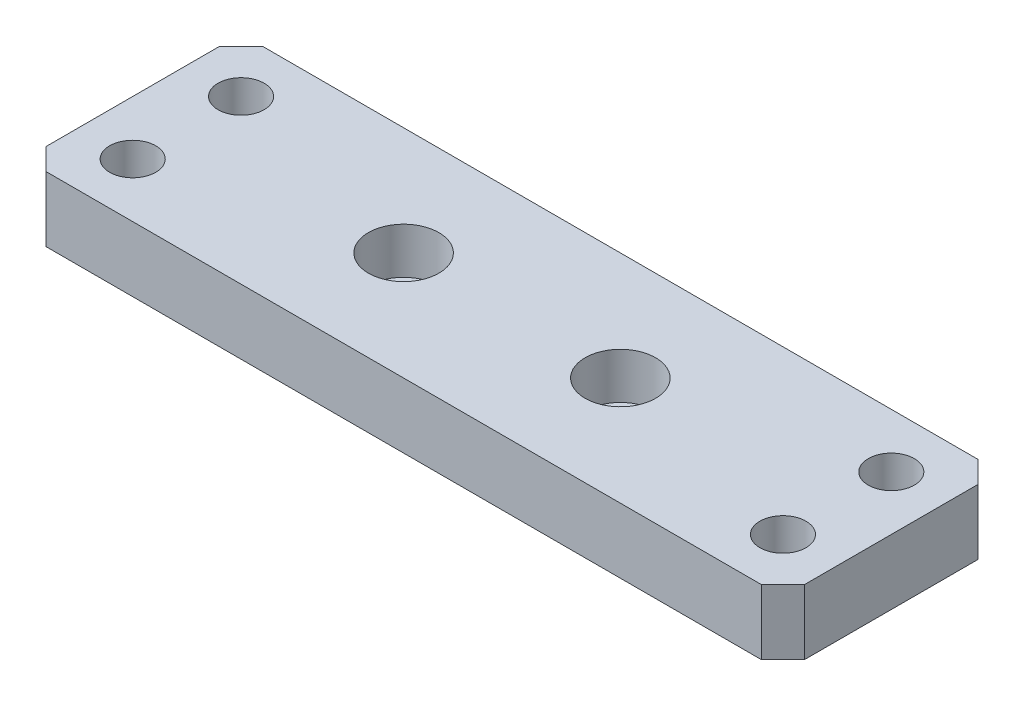
ISO-10303-21;
HEADER;
FILE_DESCRIPTION(('STEP AP214'),'2;1');
FILE_NAME('part.step','',(''),(''),'','','');
FILE_SCHEMA(('AUTOMOTIVE_DESIGN { 1 0 10303 214 1 1 1 1 }'));
ENDSEC;
DATA;
#1=APPLICATION_CONTEXT('core data for automotive mechanical design processes');
#2=APPLICATION_PROTOCOL_DEFINITION('international standard','automotive_design',2000,#1);
#3=PRODUCT_CONTEXT('',#1,'mechanical');
#4=PRODUCT('Part','Part','',(#3));
#5=PRODUCT_RELATED_PRODUCT_CATEGORY('part','',(#4));
#6=PRODUCT_DEFINITION_FORMATION('','',#4);
#7=PRODUCT_DEFINITION_CONTEXT('part definition',#1,'design');
#8=PRODUCT_DEFINITION('design','',#6,#7);
#9=PRODUCT_DEFINITION_SHAPE('','',#8);
#10=(LENGTH_UNIT() NAMED_UNIT(*) SI_UNIT(.MILLI.,.METRE.));
#11=(NAMED_UNIT(*) PLANE_ANGLE_UNIT() SI_UNIT($,.RADIAN.));
#12=(NAMED_UNIT(*) SI_UNIT($,.STERADIAN.) SOLID_ANGLE_UNIT());
#13=UNCERTAINTY_MEASURE_WITH_UNIT(LENGTH_MEASURE(1.E-05),#10,'distance_accuracy_value','');
#14=(GEOMETRIC_REPRESENTATION_CONTEXT(3) GLOBAL_UNCERTAINTY_ASSIGNED_CONTEXT((#13)) GLOBAL_UNIT_ASSIGNED_CONTEXT((#10,
#11,#12)) REPRESENTATION_CONTEXT('',''));
#15=CARTESIAN_POINT('',(0.,0.,0.));
#16=DIRECTION('',(0.,0.,1.));
#17=DIRECTION('',(1.,0.,0.));
#18=AXIS2_PLACEMENT_3D('',#15,#16,#17);
#19=CARTESIAN_POINT('',(-70.,-6.,20.));
#20=DIRECTION('',(0.,0.,1.));
#21=DIRECTION('',(1.,0.,0.));
#22=AXIS2_PLACEMENT_3D('',#19,#20,#21);
#23=PLANE('',#22);
#24=DIRECTION('',(1.,0.,0.));
#25=VECTOR('',#24,1.);
#26=CARTESIAN_POINT('',(-70.,6.,20.));
#27=LINE('',#26,#25);
#28=CARTESIAN_POINT('',(-66.,6.,20.));
#29=VERTEX_POINT('',#28);
#30=CARTESIAN_POINT('',(66.,6.,20.));
#31=VERTEX_POINT('',#30);
#32=EDGE_CURVE('E146',#29,#31,#27,.T.);
#33=ORIENTED_EDGE('',*,*,#32,.F.);
#34=DIRECTION('',(0.,-1.,0.));
#35=VECTOR('',#34,1.);
#36=CARTESIAN_POINT('',(-66.,-6.,20.));
#37=LINE('',#36,#35);
#38=CARTESIAN_POINT('',(-66.,-6.,20.));
#39=VERTEX_POINT('',#38);
#40=EDGE_CURVE('E11',#29,#39,#37,.T.);
#41=ORIENTED_EDGE('',*,*,#40,.T.);
#42=DIRECTION('',(1.,0.,0.));
#43=VECTOR('',#42,1.);
#44=CARTESIAN_POINT('',(-70.,-6.,20.));
#45=LINE('',#44,#43);
#46=CARTESIAN_POINT('',(66.,-6.,20.));
#47=VERTEX_POINT('',#46);
#48=EDGE_CURVE('E149',#39,#47,#45,.T.);
#49=ORIENTED_EDGE('',*,*,#48,.T.);
#50=DIRECTION('',(0.,1.,0.));
#51=VECTOR('',#50,1.);
#52=CARTESIAN_POINT('',(66.,-6.,20.));
#53=LINE('',#52,#51);
#54=EDGE_CURVE('E25',#47,#31,#53,.T.);
#55=ORIENTED_EDGE('',*,*,#54,.T.);
#56=EDGE_LOOP('',(#33,#41,#49,#55));
#57=FACE_BOUND('',#56,.T.);
#58=ADVANCED_FACE('F17',(#57),#23,.T.);
#59=CARTESIAN_POINT('',(-70.,-6.,-20.));
#60=DIRECTION('',(-1.,0.,0.));
#61=DIRECTION('',(0.,0.,1.));
#62=AXIS2_PLACEMENT_3D('',#59,#60,#61);
#63=PLANE('',#62);
#64=DIRECTION('',(0.,0.,1.));
#65=VECTOR('',#64,1.);
#66=CARTESIAN_POINT('',(-70.,6.,-20.));
#67=LINE('',#66,#65);
#68=CARTESIAN_POINT('',(-70.,6.,-16.));
#69=VERTEX_POINT('',#68);
#70=CARTESIAN_POINT('',(-70.,6.,16.));
#71=VERTEX_POINT('',#70);
#72=EDGE_CURVE('E103',#69,#71,#67,.T.);
#73=ORIENTED_EDGE('',*,*,#72,.F.);
#74=DIRECTION('',(0.,-1.,0.));
#75=VECTOR('',#74,1.);
#76=CARTESIAN_POINT('',(-70.,-6.,-16.));
#77=LINE('',#76,#75);
#78=CARTESIAN_POINT('',(-70.,-6.,-16.));
#79=VERTEX_POINT('',#78);
#80=EDGE_CURVE('E123',#69,#79,#77,.T.);
#81=ORIENTED_EDGE('',*,*,#80,.T.);
#82=DIRECTION('',(0.,0.,1.));
#83=VECTOR('',#82,1.);
#84=CARTESIAN_POINT('',(-70.,-6.,-20.));
#85=LINE('',#84,#83);
#86=CARTESIAN_POINT('',(-70.,-6.,16.));
#87=VERTEX_POINT('',#86);
#88=EDGE_CURVE('E106',#79,#87,#85,.T.);
#89=ORIENTED_EDGE('',*,*,#88,.T.);
#90=DIRECTION('',(0.,1.,0.));
#91=VECTOR('',#90,1.);
#92=CARTESIAN_POINT('',(-70.,-6.,16.));
#93=LINE('',#92,#91);
#94=EDGE_CURVE('E119',#87,#71,#93,.T.);
#95=ORIENTED_EDGE('',*,*,#94,.T.);
#96=EDGE_LOOP('',(#73,#81,#89,#95));
#97=FACE_BOUND('',#96,.T.);
#98=ADVANCED_FACE('F262',(#97),#63,.T.);
#99=CARTESIAN_POINT('',(70.,-6.,-20.));
#100=DIRECTION('',(0.,0.,-1.));
#101=DIRECTION('',(-1.,0.,0.));
#102=AXIS2_PLACEMENT_3D('',#99,#100,#101);
#103=PLANE('',#102);
#104=DIRECTION('',(-1.,0.,0.));
#105=VECTOR('',#104,1.);
#106=CARTESIAN_POINT('',(70.,-6.,-20.));
#107=LINE('',#106,#105);
#108=CARTESIAN_POINT('',(66.,-6.,-20.));
#109=VERTEX_POINT('',#108);
#110=CARTESIAN_POINT('',(-66.,-6.,-20.));
#111=VERTEX_POINT('',#110);
#112=EDGE_CURVE('E112',#109,#111,#107,.T.);
#113=ORIENTED_EDGE('',*,*,#112,.T.);
#114=DIRECTION('',(0.,1.,0.));
#115=VECTOR('',#114,1.);
#116=CARTESIAN_POINT('',(-66.,-6.,-20.));
#117=LINE('',#116,#115);
#118=CARTESIAN_POINT('',(-66.,6.,-20.));
#119=VERTEX_POINT('',#118);
#120=EDGE_CURVE('E101',#111,#119,#117,.T.);
#121=ORIENTED_EDGE('',*,*,#120,.T.);
#122=DIRECTION('',(-1.,0.,0.));
#123=VECTOR('',#122,1.);
#124=CARTESIAN_POINT('',(70.,6.,-20.));
#125=LINE('',#124,#123);
#126=CARTESIAN_POINT('',(66.,6.,-20.));
#127=VERTEX_POINT('',#126);
#128=EDGE_CURVE('E86',#127,#119,#125,.T.);
#129=ORIENTED_EDGE('',*,*,#128,.F.);
#130=DIRECTION('',(0.,-1.,0.));
#131=VECTOR('',#130,1.);
#132=CARTESIAN_POINT('',(66.,-6.,-20.));
#133=LINE('',#132,#131);
#134=EDGE_CURVE('E99',#127,#109,#133,.T.);
#135=ORIENTED_EDGE('',*,*,#134,.T.);
#136=EDGE_LOOP('',(#113,#121,#129,#135));
#137=FACE_BOUND('',#136,.T.);
#138=ADVANCED_FACE('F98',(#137),#103,.T.);
#139=CARTESIAN_POINT('',(70.,-6.,20.));
#140=DIRECTION('',(1.,0.,0.));
#141=DIRECTION('',(0.,0.,-1.));
#142=AXIS2_PLACEMENT_3D('',#139,#140,#141);
#143=PLANE('',#142);
#144=DIRECTION('',(0.,0.,-1.));
#145=VECTOR('',#144,1.);
#146=CARTESIAN_POINT('',(70.,-6.,20.));
#147=LINE('',#146,#145);
#148=CARTESIAN_POINT('',(70.,-6.,16.));
#149=VERTEX_POINT('',#148);
#150=CARTESIAN_POINT('',(70.,-6.,-16.));
#151=VERTEX_POINT('',#150);
#152=EDGE_CURVE('E165',#149,#151,#147,.T.);
#153=ORIENTED_EDGE('',*,*,#152,.T.);
#154=DIRECTION('',(0.,1.,0.));
#155=VECTOR('',#154,1.);
#156=CARTESIAN_POINT('',(70.,-6.,-16.));
#157=LINE('',#156,#155);
#158=CARTESIAN_POINT('',(70.,6.,-16.));
#159=VERTEX_POINT('',#158);
#160=EDGE_CURVE('E134',#151,#159,#157,.T.);
#161=ORIENTED_EDGE('',*,*,#160,.T.);
#162=DIRECTION('',(0.,0.,-1.));
#163=VECTOR('',#162,1.);
#164=CARTESIAN_POINT('',(70.,6.,20.));
#165=LINE('',#164,#163);
#166=CARTESIAN_POINT('',(70.,6.,16.));
#167=VERTEX_POINT('',#166);
#168=EDGE_CURVE('E87',#167,#159,#165,.T.);
#169=ORIENTED_EDGE('',*,*,#168,.F.);
#170=DIRECTION('',(0.,-1.,0.));
#171=VECTOR('',#170,1.);
#172=CARTESIAN_POINT('',(70.,-6.,16.));
#173=LINE('',#172,#171);
#174=EDGE_CURVE('E39',#167,#149,#173,.T.);
#175=ORIENTED_EDGE('',*,*,#174,.T.);
#176=EDGE_LOOP('',(#153,#161,#169,#175));
#177=FACE_BOUND('',#176,.T.);
#178=ADVANCED_FACE('F272',(#177),#143,.T.);
#179=CARTESIAN_POINT('',(0.,-6.,0.));
#180=DIRECTION('',(0.,1.,0.));
#181=DIRECTION('',(0.,0.,1.));
#182=AXIS2_PLACEMENT_3D('',#179,#180,#181);
#183=PLANE('',#182);
#184=CARTESIAN_POINT('',(20.,-6.,0.));
#185=DIRECTION('',(0.,1.,0.));
#186=DIRECTION('',(0.,0.,1.));
#187=AXIS2_PLACEMENT_3D('',#184,#185,#186);
#188=CIRCLE('',#187,4.25);
#189=CARTESIAN_POINT('',(20.,-6.,4.25));
#190=VERTEX_POINT('',#189);
#191=EDGE_CURVE('E212',#190,#190,#188,.T.);
#192=ORIENTED_EDGE('',*,*,#191,.T.);
#193=EDGE_LOOP('',(#192));
#194=FACE_BOUND('',#193,.T.);
#195=CARTESIAN_POINT('',(-20.,-6.,0.));
#196=DIRECTION('',(0.,1.,0.));
#197=DIRECTION('',(0.,0.,1.));
#198=AXIS2_PLACEMENT_3D('',#195,#196,#197);
#199=CIRCLE('',#198,4.25);
#200=CARTESIAN_POINT('',(-20.,-6.,4.25));
#201=VERTEX_POINT('',#200);
#202=EDGE_CURVE('E196',#201,#201,#199,.T.);
#203=ORIENTED_EDGE('',*,*,#202,.T.);
#204=EDGE_LOOP('',(#203));
#205=FACE_BOUND('',#204,.T.);
#206=CARTESIAN_POINT('',(60.,-6.,-10.));
#207=DIRECTION('',(0.,1.,0.));
#208=DIRECTION('',(0.,0.,1.));
#209=AXIS2_PLACEMENT_3D('',#206,#207,#208);
#210=CIRCLE('',#209,4.25);
#211=CARTESIAN_POINT('',(60.,-6.,-5.75));
#212=VERTEX_POINT('',#211);
#213=EDGE_CURVE('E189',#212,#212,#210,.T.);
#214=ORIENTED_EDGE('',*,*,#213,.T.);
#215=EDGE_LOOP('',(#214));
#216=FACE_BOUND('',#215,.T.);
#217=CARTESIAN_POINT('',(60.,-6.,10.));
#218=DIRECTION('',(0.,1.,0.));
#219=DIRECTION('',(0.,0.,1.));
#220=AXIS2_PLACEMENT_3D('',#217,#218,#219);
#221=CIRCLE('',#220,4.25);
#222=CARTESIAN_POINT('',(60.,-6.,14.25));
#223=VERTEX_POINT('',#222);
#224=EDGE_CURVE('E181',#223,#223,#221,.T.);
#225=ORIENTED_EDGE('',*,*,#224,.T.);
#226=EDGE_LOOP('',(#225));
#227=FACE_BOUND('',#226,.T.);
#228=CARTESIAN_POINT('',(-60.,-6.,10.));
#229=DIRECTION('',(0.,1.,0.));
#230=DIRECTION('',(0.,0.,1.));
#231=AXIS2_PLACEMENT_3D('',#228,#229,#230);
#232=CIRCLE('',#231,4.25);
#233=CARTESIAN_POINT('',(-60.,-6.,14.25));
#234=VERTEX_POINT('',#233);
#235=EDGE_CURVE('E173',#234,#234,#232,.T.);
#236=ORIENTED_EDGE('',*,*,#235,.T.);
#237=EDGE_LOOP('',(#236));
#238=FACE_BOUND('',#237,.T.);
#239=CARTESIAN_POINT('',(-60.,-6.,-10.));
#240=DIRECTION('',(0.,1.,0.));
#241=DIRECTION('',(0.,0.,1.));
#242=AXIS2_PLACEMENT_3D('',#239,#240,#241);
#243=CIRCLE('',#242,4.25);
#244=CARTESIAN_POINT('',(-60.,-6.,-5.75));
#245=VERTEX_POINT('',#244);
#246=EDGE_CURVE('E154',#245,#245,#243,.T.);
#247=ORIENTED_EDGE('',*,*,#246,.T.);
#248=EDGE_LOOP('',(#247));
#249=FACE_BOUND('',#248,.T.);
#250=ORIENTED_EDGE('',*,*,#88,.F.);
#251=DIRECTION('',(-0.707106781186544,0.,0.707106781186551));
#252=VECTOR('',#251,1.);
#253=CARTESIAN_POINT('',(-66.,-6.,-20.));
#254=LINE('',#253,#252);
#255=EDGE_CURVE('E130',#79,#111,#254,.F.);
#256=ORIENTED_EDGE('',*,*,#255,.T.);
#257=ORIENTED_EDGE('',*,*,#112,.F.);
#258=DIRECTION('',(-0.707106781186551,0.,-0.707106781186544));
#259=VECTOR('',#258,1.);
#260=CARTESIAN_POINT('',(70.,-6.,-16.));
#261=LINE('',#260,#259);
#262=EDGE_CURVE('E32',#109,#151,#261,.F.);
#263=ORIENTED_EDGE('',*,*,#262,.T.);
#264=ORIENTED_EDGE('',*,*,#152,.F.);
#265=DIRECTION('',(0.707106781186544,0.,-0.707106781186551));
#266=VECTOR('',#265,1.);
#267=CARTESIAN_POINT('',(66.,-6.,20.));
#268=LINE('',#267,#266);
#269=EDGE_CURVE('E125',#149,#47,#268,.F.);
#270=ORIENTED_EDGE('',*,*,#269,.T.);
#271=ORIENTED_EDGE('',*,*,#48,.F.);
#272=DIRECTION('',(0.707106781186551,0.,0.707106781186544));
#273=VECTOR('',#272,1.);
#274=CARTESIAN_POINT('',(-70.,-6.,16.));
#275=LINE('',#274,#273);
#276=EDGE_CURVE('E127',#39,#87,#275,.F.);
#277=ORIENTED_EDGE('',*,*,#276,.T.);
#278=EDGE_LOOP('',(#250,#256,#257,#263,#264,#270,#271,#277));
#279=FACE_BOUND('',#278,.T.);
#280=ADVANCED_FACE('F235',(#194,#205,#216,#227,#238,#249,#279),#183,.F.);
#281=CARTESIAN_POINT('',(0.,6.,0.));
#282=DIRECTION('',(0.,1.,0.));
#283=DIRECTION('',(0.,0.,1.));
#284=AXIS2_PLACEMENT_3D('',#281,#282,#283);
#285=PLANE('',#284);
#286=CARTESIAN_POINT('',(20.,6.,0.));
#287=DIRECTION('',(0.,1.,0.));
#288=DIRECTION('',(0.,0.,1.));
#289=AXIS2_PLACEMENT_3D('',#286,#287,#288);
#290=CIRCLE('',#289,6.5);
#291=CARTESIAN_POINT('',(20.,6.,6.5));
#292=VERTEX_POINT('',#291);
#293=EDGE_CURVE('E224',#292,#292,#290,.T.);
#294=ORIENTED_EDGE('',*,*,#293,.F.);
#295=EDGE_LOOP('',(#294));
#296=FACE_BOUND('',#295,.T.);
#297=CARTESIAN_POINT('',(-20.,6.,0.));
#298=DIRECTION('',(0.,1.,0.));
#299=DIRECTION('',(0.,0.,1.));
#300=AXIS2_PLACEMENT_3D('',#297,#298,#299);
#301=CIRCLE('',#300,6.5);
#302=CARTESIAN_POINT('',(-20.,6.,6.5));
#303=VERTEX_POINT('',#302);
#304=EDGE_CURVE('E208',#303,#303,#301,.T.);
#305=ORIENTED_EDGE('',*,*,#304,.F.);
#306=EDGE_LOOP('',(#305));
#307=FACE_BOUND('',#306,.T.);
#308=CARTESIAN_POINT('',(60.,6.,-10.));
#309=DIRECTION('',(0.,1.,0.));
#310=DIRECTION('',(0.,0.,1.));
#311=AXIS2_PLACEMENT_3D('',#308,#309,#310);
#312=CIRCLE('',#311,4.25);
#313=CARTESIAN_POINT('',(60.,6.,-5.75));
#314=VERTEX_POINT('',#313);
#315=EDGE_CURVE('E192',#314,#314,#312,.T.);
#316=ORIENTED_EDGE('',*,*,#315,.F.);
#317=EDGE_LOOP('',(#316));
#318=FACE_BOUND('',#317,.T.);
#319=CARTESIAN_POINT('',(60.,6.,10.));
#320=DIRECTION('',(0.,1.,0.));
#321=DIRECTION('',(0.,0.,1.));
#322=AXIS2_PLACEMENT_3D('',#319,#320,#321);
#323=CIRCLE('',#322,4.25);
#324=CARTESIAN_POINT('',(60.,6.,14.25));
#325=VERTEX_POINT('',#324);
#326=EDGE_CURVE('E185',#325,#325,#323,.T.);
#327=ORIENTED_EDGE('',*,*,#326,.F.);
#328=EDGE_LOOP('',(#327));
#329=FACE_BOUND('',#328,.T.);
#330=CARTESIAN_POINT('',(-60.,6.,10.));
#331=DIRECTION('',(0.,1.,0.));
#332=DIRECTION('',(0.,0.,1.));
#333=AXIS2_PLACEMENT_3D('',#330,#331,#332);
#334=CIRCLE('',#333,4.25);
#335=CARTESIAN_POINT('',(-60.,6.,14.25));
#336=VERTEX_POINT('',#335);
#337=EDGE_CURVE('E177',#336,#336,#334,.T.);
#338=ORIENTED_EDGE('',*,*,#337,.F.);
#339=EDGE_LOOP('',(#338));
#340=FACE_BOUND('',#339,.T.);
#341=CARTESIAN_POINT('',(-60.,6.,-10.));
#342=DIRECTION('',(0.,1.,0.));
#343=DIRECTION('',(0.,0.,1.));
#344=AXIS2_PLACEMENT_3D('',#341,#342,#343);
#345=CIRCLE('',#344,4.25);
#346=CARTESIAN_POINT('',(-60.,6.,-5.75));
#347=VERTEX_POINT('',#346);
#348=EDGE_CURVE('E160',#347,#347,#345,.T.);
#349=ORIENTED_EDGE('',*,*,#348,.F.);
#350=EDGE_LOOP('',(#349));
#351=FACE_BOUND('',#350,.T.);
#352=ORIENTED_EDGE('',*,*,#128,.T.);
#353=DIRECTION('',(0.707106781186544,0.,-0.707106781186551));
#354=VECTOR('',#353,1.);
#355=CARTESIAN_POINT('',(-43.,6.,-43.));
#356=LINE('',#355,#354);
#357=EDGE_CURVE('E92',#119,#69,#356,.F.);
#358=ORIENTED_EDGE('',*,*,#357,.T.);
#359=ORIENTED_EDGE('',*,*,#72,.T.);
#360=DIRECTION('',(-0.707106781186551,0.,-0.707106781186544));
#361=VECTOR('',#360,1.);
#362=CARTESIAN_POINT('',(-43.,6.,43.));
#363=LINE('',#362,#361);
#364=EDGE_CURVE('E93',#71,#29,#363,.F.);
#365=ORIENTED_EDGE('',*,*,#364,.T.);
#366=ORIENTED_EDGE('',*,*,#32,.T.);
#367=DIRECTION('',(-0.707106781186544,0.,0.707106781186551));
#368=VECTOR('',#367,1.);
#369=CARTESIAN_POINT('',(43.,6.,43.));
#370=LINE('',#369,#368);
#371=EDGE_CURVE('E108',#31,#167,#370,.F.);
#372=ORIENTED_EDGE('',*,*,#371,.T.);
#373=ORIENTED_EDGE('',*,*,#168,.T.);
#374=DIRECTION('',(0.707106781186551,0.,0.707106781186544));
#375=VECTOR('',#374,1.);
#376=CARTESIAN_POINT('',(43.,6.,-43.));
#377=LINE('',#376,#375);
#378=EDGE_CURVE('E83',#159,#127,#377,.F.);
#379=ORIENTED_EDGE('',*,*,#378,.T.);
#380=EDGE_LOOP('',(#352,#358,#359,#365,#366,#372,#373,#379));
#381=FACE_BOUND('',#380,.T.);
#382=ADVANCED_FACE('F85',(#296,#307,#318,#329,#340,#351,#381),#285,.T.);
#383=CARTESIAN_POINT('',(-60.,6.,-10.));
#384=DIRECTION('',(0.,1.,0.));
#385=DIRECTION('',(0.,0.,1.));
#386=AXIS2_PLACEMENT_3D('',#383,#384,#385);
#387=CYLINDRICAL_SURFACE('',#386,4.25);
#388=ORIENTED_EDGE('',*,*,#246,.F.);
#389=EDGE_LOOP('',(#388));
#390=FACE_BOUND('',#389,.T.);
#391=ORIENTED_EDGE('',*,*,#348,.T.);
#392=EDGE_LOOP('',(#391));
#393=FACE_BOUND('',#392,.T.);
#394=ADVANCED_FACE('F234',(#390,#393),#387,.F.);
#395=CARTESIAN_POINT('',(-60.,6.,10.));
#396=DIRECTION('',(0.,1.,0.));
#397=DIRECTION('',(0.,0.,1.));
#398=AXIS2_PLACEMENT_3D('',#395,#396,#397);
#399=CYLINDRICAL_SURFACE('',#398,4.25);
#400=ORIENTED_EDGE('',*,*,#235,.F.);
#401=EDGE_LOOP('',(#400));
#402=FACE_BOUND('',#401,.T.);
#403=ORIENTED_EDGE('',*,*,#337,.T.);
#404=EDGE_LOOP('',(#403));
#405=FACE_BOUND('',#404,.T.);
#406=ADVANCED_FACE('F248',(#402,#405),#399,.F.);
#407=CARTESIAN_POINT('',(60.,6.,10.));
#408=DIRECTION('',(0.,1.,0.));
#409=DIRECTION('',(0.,0.,1.));
#410=AXIS2_PLACEMENT_3D('',#407,#408,#409);
#411=CYLINDRICAL_SURFACE('',#410,4.25);
#412=ORIENTED_EDGE('',*,*,#224,.F.);
#413=EDGE_LOOP('',(#412));
#414=FACE_BOUND('',#413,.T.);
#415=ORIENTED_EDGE('',*,*,#326,.T.);
#416=EDGE_LOOP('',(#415));
#417=FACE_BOUND('',#416,.T.);
#418=ADVANCED_FACE('F256',(#414,#417),#411,.F.);
#419=CARTESIAN_POINT('',(60.,6.,-10.));
#420=DIRECTION('',(0.,1.,0.));
#421=DIRECTION('',(0.,0.,1.));
#422=AXIS2_PLACEMENT_3D('',#419,#420,#421);
#423=CYLINDRICAL_SURFACE('',#422,4.25);
#424=ORIENTED_EDGE('',*,*,#213,.F.);
#425=EDGE_LOOP('',(#424));
#426=FACE_BOUND('',#425,.T.);
#427=ORIENTED_EDGE('',*,*,#315,.T.);
#428=EDGE_LOOP('',(#427));
#429=FACE_BOUND('',#428,.T.);
#430=ADVANCED_FACE('F394',(#426,#429),#423,.F.);
#431=CARTESIAN_POINT('',(-20.,6.,0.));
#432=DIRECTION('',(0.,1.,0.));
#433=DIRECTION('',(0.,0.,1.));
#434=AXIS2_PLACEMENT_3D('',#431,#432,#433);
#435=CYLINDRICAL_SURFACE('',#434,4.25);
#436=ORIENTED_EDGE('',*,*,#202,.F.);
#437=EDGE_LOOP('',(#436));
#438=FACE_BOUND('',#437,.T.);
#439=CARTESIAN_POINT('',(-20.,-2.5,0.));
#440=DIRECTION('',(0.,1.,0.));
#441=DIRECTION('',(0.,0.,1.));
#442=AXIS2_PLACEMENT_3D('',#439,#440,#441);
#443=CIRCLE('',#442,4.25);
#444=CARTESIAN_POINT('',(-20.,-2.5,4.25));
#445=VERTEX_POINT('',#444);
#446=EDGE_CURVE('E200',#445,#445,#443,.T.);
#447=ORIENTED_EDGE('',*,*,#446,.T.);
#448=EDGE_LOOP('',(#447));
#449=FACE_BOUND('',#448,.T.);
#450=ADVANCED_FACE('F402',(#438,#449),#435,.F.);
#451=CARTESIAN_POINT('',(-15.75,-2.5,0.));
#452=DIRECTION('',(0.,-1.,0.));
#453=DIRECTION('',(0.,0.,-1.));
#454=AXIS2_PLACEMENT_3D('',#451,#452,#453);
#455=PLANE('',#454);
#456=ORIENTED_EDGE('',*,*,#446,.F.);
#457=EDGE_LOOP('',(#456));
#458=FACE_BOUND('',#457,.T.);
#459=CARTESIAN_POINT('',(-20.,-2.5,0.));
#460=DIRECTION('',(0.,1.,0.));
#461=DIRECTION('',(0.,0.,1.));
#462=AXIS2_PLACEMENT_3D('',#459,#460,#461);
#463=CIRCLE('',#462,6.5);
#464=CARTESIAN_POINT('',(-20.,-2.5,6.5));
#465=VERTEX_POINT('',#464);
#466=EDGE_CURVE('E204',#465,#465,#463,.T.);
#467=ORIENTED_EDGE('',*,*,#466,.T.);
#468=EDGE_LOOP('',(#467));
#469=FACE_BOUND('',#468,.T.);
#470=ADVANCED_FACE('F410',(#458,#469),#455,.F.);
#471=CARTESIAN_POINT('',(-20.,6.,0.));
#472=DIRECTION('',(0.,1.,0.));
#473=DIRECTION('',(0.,0.,1.));
#474=AXIS2_PLACEMENT_3D('',#471,#472,#473);
#475=CYLINDRICAL_SURFACE('',#474,6.5);
#476=ORIENTED_EDGE('',*,*,#466,.F.);
#477=EDGE_LOOP('',(#476));
#478=FACE_BOUND('',#477,.T.);
#479=ORIENTED_EDGE('',*,*,#304,.T.);
#480=EDGE_LOOP('',(#479));
#481=FACE_BOUND('',#480,.T.);
#482=ADVANCED_FACE('F418',(#478,#481),#475,.F.);
#483=CARTESIAN_POINT('',(20.,6.,0.));
#484=DIRECTION('',(0.,1.,0.));
#485=DIRECTION('',(0.,0.,1.));
#486=AXIS2_PLACEMENT_3D('',#483,#484,#485);
#487=CYLINDRICAL_SURFACE('',#486,4.25);
#488=ORIENTED_EDGE('',*,*,#191,.F.);
#489=EDGE_LOOP('',(#488));
#490=FACE_BOUND('',#489,.T.);
#491=CARTESIAN_POINT('',(20.,-2.5,0.));
#492=DIRECTION('',(0.,1.,0.));
#493=DIRECTION('',(0.,0.,1.));
#494=AXIS2_PLACEMENT_3D('',#491,#492,#493);
#495=CIRCLE('',#494,4.25);
#496=CARTESIAN_POINT('',(20.,-2.5,4.25));
#497=VERTEX_POINT('',#496);
#498=EDGE_CURVE('E216',#497,#497,#495,.T.);
#499=ORIENTED_EDGE('',*,*,#498,.T.);
#500=EDGE_LOOP('',(#499));
#501=FACE_BOUND('',#500,.T.);
#502=ADVANCED_FACE('F438',(#490,#501),#487,.F.);
#503=CARTESIAN_POINT('',(24.25,-2.5,0.));
#504=DIRECTION('',(0.,-1.,0.));
#505=DIRECTION('',(0.,0.,-1.));
#506=AXIS2_PLACEMENT_3D('',#503,#504,#505);
#507=PLANE('',#506);
#508=ORIENTED_EDGE('',*,*,#498,.F.);
#509=EDGE_LOOP('',(#508));
#510=FACE_BOUND('',#509,.T.);
#511=CARTESIAN_POINT('',(20.,-2.5,0.));
#512=DIRECTION('',(0.,1.,0.));
#513=DIRECTION('',(0.,0.,1.));
#514=AXIS2_PLACEMENT_3D('',#511,#512,#513);
#515=CIRCLE('',#514,6.5);
#516=CARTESIAN_POINT('',(20.,-2.5,6.5));
#517=VERTEX_POINT('',#516);
#518=EDGE_CURVE('E220',#517,#517,#515,.T.);
#519=ORIENTED_EDGE('',*,*,#518,.T.);
#520=EDGE_LOOP('',(#519));
#521=FACE_BOUND('',#520,.T.);
#522=ADVANCED_FACE('F428',(#510,#521),#507,.F.);
#523=CARTESIAN_POINT('',(20.,6.,0.));
#524=DIRECTION('',(0.,1.,0.));
#525=DIRECTION('',(0.,0.,1.));
#526=AXIS2_PLACEMENT_3D('',#523,#524,#525);
#527=CYLINDRICAL_SURFACE('',#526,6.5);
#528=ORIENTED_EDGE('',*,*,#518,.F.);
#529=EDGE_LOOP('',(#528));
#530=FACE_BOUND('',#529,.T.);
#531=ORIENTED_EDGE('',*,*,#293,.T.);
#532=EDGE_LOOP('',(#531));
#533=FACE_BOUND('',#532,.T.);
#534=ADVANCED_FACE('F230',(#530,#533),#527,.F.);
#535=CARTESIAN_POINT('',(-66.,-6.,-20.));
#536=DIRECTION('',(0.707106781186551,0.,0.707106781186544));
#537=DIRECTION('',(0.,1.,0.));
#538=AXIS2_PLACEMENT_3D('',#535,#536,#537);
#539=PLANE('',#538);
#540=ORIENTED_EDGE('',*,*,#255,.F.);
#541=ORIENTED_EDGE('',*,*,#80,.F.);
#542=ORIENTED_EDGE('',*,*,#357,.F.);
#543=ORIENTED_EDGE('',*,*,#120,.F.);
#544=EDGE_LOOP('',(#540,#541,#542,#543));
#545=FACE_BOUND('',#544,.T.);
#546=ADVANCED_FACE('F274',(#545),#539,.F.);
#547=CARTESIAN_POINT('',(70.,-6.,-16.));
#548=DIRECTION('',(-0.707106781186544,0.,0.707106781186551));
#549=DIRECTION('',(0.,1.,0.));
#550=AXIS2_PLACEMENT_3D('',#547,#548,#549);
#551=PLANE('',#550);
#552=ORIENTED_EDGE('',*,*,#262,.F.);
#553=ORIENTED_EDGE('',*,*,#134,.F.);
#554=ORIENTED_EDGE('',*,*,#378,.F.);
#555=ORIENTED_EDGE('',*,*,#160,.F.);
#556=EDGE_LOOP('',(#552,#553,#554,#555));
#557=FACE_BOUND('',#556,.T.);
#558=ADVANCED_FACE('F105',(#557),#551,.F.);
#559=CARTESIAN_POINT('',(-70.,-6.,16.));
#560=DIRECTION('',(0.707106781186544,0.,-0.707106781186551));
#561=DIRECTION('',(0.,1.,0.));
#562=AXIS2_PLACEMENT_3D('',#559,#560,#561);
#563=PLANE('',#562);
#564=ORIENTED_EDGE('',*,*,#276,.F.);
#565=ORIENTED_EDGE('',*,*,#40,.F.);
#566=ORIENTED_EDGE('',*,*,#364,.F.);
#567=ORIENTED_EDGE('',*,*,#94,.F.);
#568=EDGE_LOOP('',(#564,#565,#566,#567));
#569=FACE_BOUND('',#568,.T.);
#570=ADVANCED_FACE('F279',(#569),#563,.F.);
#571=CARTESIAN_POINT('',(66.,-6.,20.));
#572=DIRECTION('',(-0.707106781186551,0.,-0.707106781186544));
#573=DIRECTION('',(0.,1.,0.));
#574=AXIS2_PLACEMENT_3D('',#571,#572,#573);
#575=PLANE('',#574);
#576=ORIENTED_EDGE('',*,*,#269,.F.);
#577=ORIENTED_EDGE('',*,*,#174,.F.);
#578=ORIENTED_EDGE('',*,*,#371,.F.);
#579=ORIENTED_EDGE('',*,*,#54,.F.);
#580=EDGE_LOOP('',(#576,#577,#578,#579));
#581=FACE_BOUND('',#580,.T.);
#582=ADVANCED_FACE('F19',(#581),#575,.F.);
#583=CLOSED_SHELL('',(#58,#98,#138,#178,#280,#382,#394,#406,#418,#430,#450,#470,#482,#502,#522,
#534,#546,#558,#570,#582));
#584=MANIFOLD_SOLID_BREP('B1',#583);
#585=ADVANCED_BREP_SHAPE_REPRESENTATION('',(#18,#584),#14);
#586=SHAPE_DEFINITION_REPRESENTATION(#9,#585);
ENDSEC;
END-ISO-10303-21;
